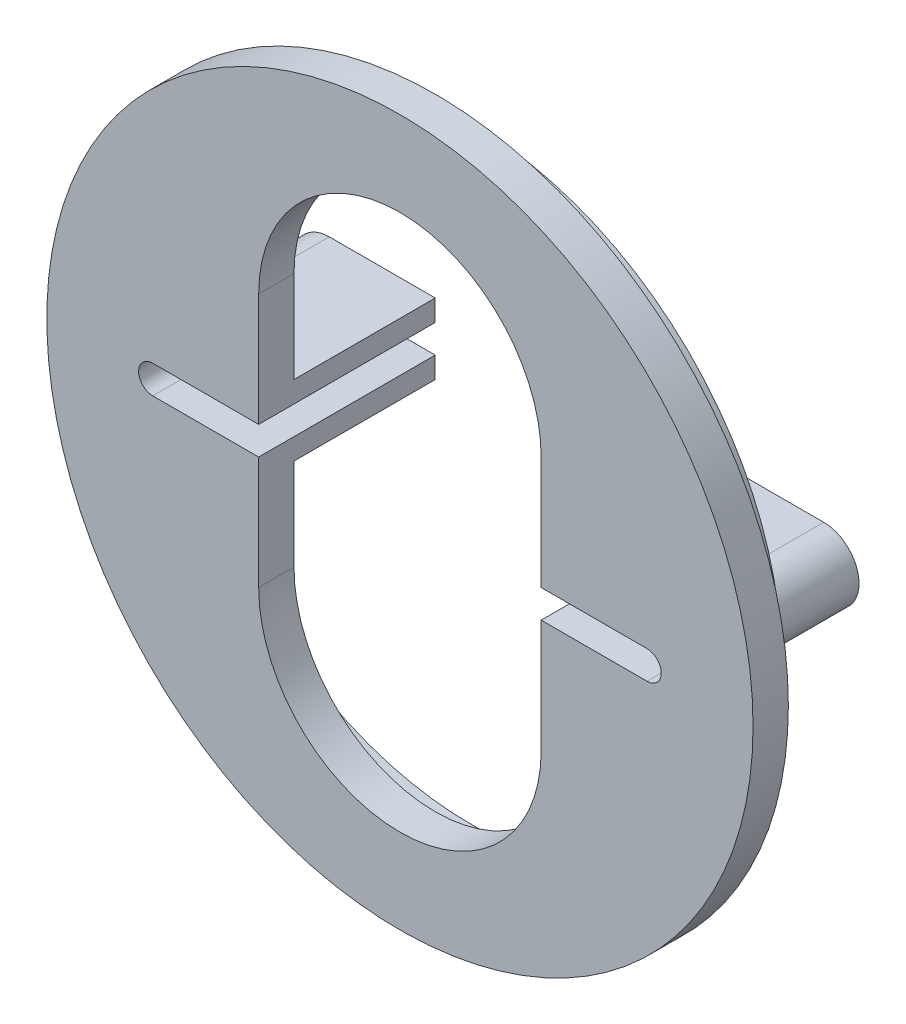
ISO-10303-21;
HEADER;
FILE_DESCRIPTION(('STEP AP214'),'2;1');
FILE_NAME('part.step','',(''),(''),'','','');
FILE_SCHEMA(('AUTOMOTIVE_DESIGN { 1 0 10303 214 1 1 1 1 }'));
ENDSEC;
DATA;
#1=APPLICATION_CONTEXT('core data for automotive mechanical design processes');
#2=APPLICATION_PROTOCOL_DEFINITION('international standard','automotive_design',2000,#1);
#3=PRODUCT_CONTEXT('',#1,'mechanical');
#4=PRODUCT('Part','Part','',(#3));
#5=PRODUCT_RELATED_PRODUCT_CATEGORY('part','',(#4));
#6=PRODUCT_DEFINITION_FORMATION('','',#4);
#7=PRODUCT_DEFINITION_CONTEXT('part definition',#1,'design');
#8=PRODUCT_DEFINITION('design','',#6,#7);
#9=PRODUCT_DEFINITION_SHAPE('','',#8);
#10=(LENGTH_UNIT() NAMED_UNIT(*) SI_UNIT(.MILLI.,.METRE.));
#11=(NAMED_UNIT(*) PLANE_ANGLE_UNIT() SI_UNIT($,.RADIAN.));
#12=(NAMED_UNIT(*) SI_UNIT($,.STERADIAN.) SOLID_ANGLE_UNIT());
#13=UNCERTAINTY_MEASURE_WITH_UNIT(LENGTH_MEASURE(1.E-05),#10,'distance_accuracy_value','');
#14=(GEOMETRIC_REPRESENTATION_CONTEXT(3) GLOBAL_UNCERTAINTY_ASSIGNED_CONTEXT((#13)) GLOBAL_UNIT_ASSIGNED_CONTEXT((#10,
#11,#12)) REPRESENTATION_CONTEXT('',''));
#15=CARTESIAN_POINT('',(0.,0.,0.));
#16=DIRECTION('',(0.,0.,1.));
#17=DIRECTION('',(1.,0.,0.));
#18=AXIS2_PLACEMENT_3D('',#15,#16,#17);
#19=CARTESIAN_POINT('',(0.,0.,0.));
#20=DIRECTION('',(0.,0.,1.));
#21=DIRECTION('',(1.,0.,0.));
#22=AXIS2_PLACEMENT_3D('',#19,#20,#21);
#23=PLANE('',#22);
#24=DIRECTION('',(0.,-1.,0.));
#25=VECTOR('',#24,1.);
#26=CARTESIAN_POINT('',(-20.,0.,0.));
#27=LINE('',#26,#25);
#28=CARTESIAN_POINT('',(-20.,18.,0.));
#29=VERTEX_POINT('',#28);
#30=CARTESIAN_POINT('',(-20.,5.,0.));
#31=VERTEX_POINT('',#30);
#32=EDGE_CURVE('E358',#29,#31,#27,.T.);
#33=ORIENTED_EDGE('',*,*,#32,.T.);
#34=DIRECTION('',(-1.,0.,0.));
#35=VECTOR('',#34,1.);
#36=CARTESIAN_POINT('',(0.,5.,0.));
#37=LINE('',#36,#35);
#38=CARTESIAN_POINT('',(-35.,5.,0.));
#39=VERTEX_POINT('',#38);
#40=EDGE_CURVE('E233',#31,#39,#37,.T.);
#41=ORIENTED_EDGE('',*,*,#40,.T.);
#42=CARTESIAN_POINT('',(-35.,0.,0.));
#43=DIRECTION('',(0.,0.,1.));
#44=DIRECTION('',(1.,0.,0.));
#45=AXIS2_PLACEMENT_3D('',#42,#43,#44);
#46=CIRCLE('',#45,5.);
#47=CARTESIAN_POINT('',(-35.,-5.,0.));
#48=VERTEX_POINT('',#47);
#49=EDGE_CURVE('E185',#39,#48,#46,.T.);
#50=ORIENTED_EDGE('',*,*,#49,.T.);
#51=DIRECTION('',(-1.,0.,0.));
#52=VECTOR('',#51,1.);
#53=CARTESIAN_POINT('',(0.,-5.,0.));
#54=LINE('',#53,#52);
#55=CARTESIAN_POINT('',(-20.,-5.,0.));
#56=VERTEX_POINT('',#55);
#57=EDGE_CURVE('E57',#56,#48,#54,.T.);
#58=ORIENTED_EDGE('',*,*,#57,.F.);
#59=DIRECTION('',(0.,-1.,0.));
#60=VECTOR('',#59,1.);
#61=CARTESIAN_POINT('',(-20.,0.,0.));
#62=LINE('',#61,#60);
#63=CARTESIAN_POINT('',(-20.,-18.,0.));
#64=VERTEX_POINT('',#63);
#65=EDGE_CURVE('E355',#56,#64,#62,.T.);
#66=ORIENTED_EDGE('',*,*,#65,.T.);
#67=CARTESIAN_POINT('',(0.,-18.,0.));
#68=DIRECTION('',(0.,0.,1.));
#69=DIRECTION('',(1.,0.,0.));
#70=AXIS2_PLACEMENT_3D('',#67,#68,#69);
#71=CIRCLE('',#70,20.);
#72=CARTESIAN_POINT('',(20.,-18.,0.));
#73=VERTEX_POINT('',#72);
#74=EDGE_CURVE('E350',#73,#64,#71,.F.);
#75=ORIENTED_EDGE('',*,*,#74,.F.);
#76=DIRECTION('',(0.,-1.,0.));
#77=VECTOR('',#76,1.);
#78=CARTESIAN_POINT('',(20.,0.,0.));
#79=LINE('',#78,#77);
#80=CARTESIAN_POINT('',(20.,-5.,0.));
#81=VERTEX_POINT('',#80);
#82=EDGE_CURVE('E291',#81,#73,#79,.T.);
#83=ORIENTED_EDGE('',*,*,#82,.F.);
#84=DIRECTION('',(1.,0.,0.));
#85=VECTOR('',#84,1.);
#86=CARTESIAN_POINT('',(0.,-5.,0.));
#87=LINE('',#86,#85);
#88=CARTESIAN_POINT('',(35.,-5.,0.));
#89=VERTEX_POINT('',#88);
#90=EDGE_CURVE('E65',#81,#89,#87,.T.);
#91=ORIENTED_EDGE('',*,*,#90,.T.);
#92=CARTESIAN_POINT('',(35.,0.,0.));
#93=DIRECTION('',(0.,0.,1.));
#94=DIRECTION('',(1.,0.,0.));
#95=AXIS2_PLACEMENT_3D('',#92,#93,#94);
#96=CIRCLE('',#95,5.);
#97=CARTESIAN_POINT('',(35.,5.,0.));
#98=VERTEX_POINT('',#97);
#99=EDGE_CURVE('E280',#98,#89,#96,.F.);
#100=ORIENTED_EDGE('',*,*,#99,.F.);
#101=DIRECTION('',(1.,0.,0.));
#102=VECTOR('',#101,1.);
#103=CARTESIAN_POINT('',(0.,5.,0.));
#104=LINE('',#103,#102);
#105=CARTESIAN_POINT('',(20.,5.,0.));
#106=VERTEX_POINT('',#105);
#107=EDGE_CURVE('E251',#106,#98,#104,.T.);
#108=ORIENTED_EDGE('',*,*,#107,.F.);
#109=CARTESIAN_POINT('',(20.,18.,0.));
#110=VERTEX_POINT('',#109);
#111=EDGE_CURVE('E351',#110,#106,#79,.T.);
#112=ORIENTED_EDGE('',*,*,#111,.F.);
#113=CARTESIAN_POINT('',(0.,18.,0.));
#114=DIRECTION('',(0.,0.,1.));
#115=DIRECTION('',(1.,0.,0.));
#116=AXIS2_PLACEMENT_3D('',#113,#114,#115);
#117=CIRCLE('',#116,20.);
#118=EDGE_CURVE('E362',#110,#29,#117,.T.);
#119=ORIENTED_EDGE('',*,*,#118,.T.);
#120=EDGE_LOOP('',(#33,#41,#50,#58,#66,#75,#83,#91,#100,#108,#112,#119));
#121=FACE_BOUND('',#120,.T.);
#122=CARTESIAN_POINT('',(0.,0.,0.));
#123=DIRECTION('',(0.,0.,1.));
#124=DIRECTION('',(1.,0.,0.));
#125=AXIS2_PLACEMENT_3D('',#122,#123,#124);
#126=CIRCLE('',#125,42.);
#127=CARTESIAN_POINT('',(42.,0.,0.));
#128=VERTEX_POINT('',#127);
#129=EDGE_CURVE('E11',#128,#128,#126,.T.);
#130=ORIENTED_EDGE('',*,*,#129,.F.);
#131=EDGE_LOOP('',(#130));
#132=FACE_BOUND('',#131,.T.);
#133=ADVANCED_FACE('F41',(#121,#132),#23,.F.);
#134=CARTESIAN_POINT('',(35.,0.,5.));
#135=DIRECTION('',(0.,0.,-1.));
#136=DIRECTION('',(-1.,0.,0.));
#137=AXIS2_PLACEMENT_3D('',#134,#135,#136);
#138=CYLINDRICAL_SURFACE('',#137,2.);
#139=DIRECTION('',(0.,0.,-1.));
#140=VECTOR('',#139,1.);
#141=CARTESIAN_POINT('',(35.,2.,5.));
#142=LINE('',#141,#140);
#143=CARTESIAN_POINT('',(35.,2.,5.));
#144=VERTEX_POINT('',#143);
#145=CARTESIAN_POINT('',(35.,2.,-20.));
#146=VERTEX_POINT('',#145);
#147=EDGE_CURVE('E347',#144,#146,#142,.T.);
#148=ORIENTED_EDGE('',*,*,#147,.T.);
#149=CARTESIAN_POINT('',(35.,0.,-20.));
#150=DIRECTION('',(0.,0.,1.));
#151=DIRECTION('',(1.,0.,0.));
#152=AXIS2_PLACEMENT_3D('',#149,#150,#151);
#153=CIRCLE('',#152,2.);
#154=CARTESIAN_POINT('',(35.,-2.,-20.));
#155=VERTEX_POINT('',#154);
#156=EDGE_CURVE('E250',#146,#155,#153,.F.);
#157=ORIENTED_EDGE('',*,*,#156,.T.);
#158=DIRECTION('',(0.,0.,-1.));
#159=VECTOR('',#158,1.);
#160=CARTESIAN_POINT('',(35.,-2.,5.));
#161=LINE('',#160,#159);
#162=CARTESIAN_POINT('',(35.,-2.,5.));
#163=VERTEX_POINT('',#162);
#164=EDGE_CURVE('E50',#163,#155,#161,.T.);
#165=ORIENTED_EDGE('',*,*,#164,.F.);
#166=CARTESIAN_POINT('',(35.,0.,5.));
#167=DIRECTION('',(0.,0.,1.));
#168=DIRECTION('',(1.,0.,0.));
#169=AXIS2_PLACEMENT_3D('',#166,#167,#168);
#170=CIRCLE('',#169,2.);
#171=EDGE_CURVE('E302',#144,#163,#170,.F.);
#172=ORIENTED_EDGE('',*,*,#171,.F.);
#173=EDGE_LOOP('',(#148,#157,#165,#172));
#174=FACE_BOUND('',#173,.T.);
#175=ADVANCED_FACE('F43',(#174),#138,.F.);
#176=CARTESIAN_POINT('',(0.,-2.,5.));
#177=DIRECTION('',(0.,1.,0.));
#178=DIRECTION('',(-1.,0.,0.));
#179=AXIS2_PLACEMENT_3D('',#176,#177,#178);
#180=PLANE('',#179);
#181=ORIENTED_EDGE('',*,*,#164,.T.);
#182=DIRECTION('',(1.,0.,0.));
#183=VECTOR('',#182,1.);
#184=CARTESIAN_POINT('',(0.,-2.,-20.));
#185=LINE('',#184,#183);
#186=CARTESIAN_POINT('',(20.,-2.,-20.));
#187=VERTEX_POINT('',#186);
#188=EDGE_CURVE('E255',#187,#155,#185,.T.);
#189=ORIENTED_EDGE('',*,*,#188,.F.);
#190=DIRECTION('',(0.,0.,-1.));
#191=VECTOR('',#190,1.);
#192=CARTESIAN_POINT('',(20.,-2.,5.));
#193=LINE('',#192,#191);
#194=CARTESIAN_POINT('',(20.,-2.,5.));
#195=VERTEX_POINT('',#194);
#196=EDGE_CURVE('E400',#195,#187,#193,.T.);
#197=ORIENTED_EDGE('',*,*,#196,.F.);
#198=DIRECTION('',(1.,0.,0.));
#199=VECTOR('',#198,1.);
#200=CARTESIAN_POINT('',(0.,-2.,5.));
#201=LINE('',#200,#199);
#202=EDGE_CURVE('E305',#195,#163,#201,.T.);
#203=ORIENTED_EDGE('',*,*,#202,.T.);
#204=EDGE_LOOP('',(#181,#189,#197,#203));
#205=FACE_BOUND('',#204,.T.);
#206=ADVANCED_FACE('F406',(#205),#180,.T.);
#207=CARTESIAN_POINT('',(20.,0.,5.));
#208=DIRECTION('',(1.,0.,0.));
#209=DIRECTION('',(0.,0.,-1.));
#210=AXIS2_PLACEMENT_3D('',#207,#208,#209);
#211=PLANE('',#210);
#212=ORIENTED_EDGE('',*,*,#196,.T.);
#213=DIRECTION('',(0.,-1.,0.));
#214=VECTOR('',#213,1.);
#215=CARTESIAN_POINT('',(20.,0.,-20.));
#216=LINE('',#215,#214);
#217=CARTESIAN_POINT('',(20.,-5.,-20.));
#218=VERTEX_POINT('',#217);
#219=EDGE_CURVE('E259',#187,#218,#216,.T.);
#220=ORIENTED_EDGE('',*,*,#219,.T.);
#221=DIRECTION('',(0.,0.,1.));
#222=VECTOR('',#221,1.);
#223=CARTESIAN_POINT('',(20.,-5.,-20.));
#224=LINE('',#223,#222);
#225=EDGE_CURVE('E277',#218,#81,#224,.T.);
#226=ORIENTED_EDGE('',*,*,#225,.T.);
#227=ORIENTED_EDGE('',*,*,#82,.T.);
#228=DIRECTION('',(0.,0.,-1.));
#229=VECTOR('',#228,1.);
#230=CARTESIAN_POINT('',(20.,-18.,5.));
#231=LINE('',#230,#229);
#232=CARTESIAN_POINT('',(20.,-18.,5.));
#233=VERTEX_POINT('',#232);
#234=EDGE_CURVE('E396',#233,#73,#231,.T.);
#235=ORIENTED_EDGE('',*,*,#234,.F.);
#236=DIRECTION('',(0.,-1.,0.));
#237=VECTOR('',#236,1.);
#238=CARTESIAN_POINT('',(20.,0.,5.));
#239=LINE('',#238,#237);
#240=EDGE_CURVE('E310',#195,#233,#239,.T.);
#241=ORIENTED_EDGE('',*,*,#240,.F.);
#242=EDGE_LOOP('',(#212,#220,#226,#227,#235,#241));
#243=FACE_BOUND('',#242,.T.);
#244=ADVANCED_FACE('F438',(#243),#211,.F.);
#245=CARTESIAN_POINT('',(0.,-18.,5.));
#246=DIRECTION('',(0.,0.,-1.));
#247=DIRECTION('',(-1.,0.,0.));
#248=AXIS2_PLACEMENT_3D('',#245,#246,#247);
#249=CYLINDRICAL_SURFACE('',#248,20.);
#250=ORIENTED_EDGE('',*,*,#74,.T.);
#251=DIRECTION('',(0.,0.,-1.));
#252=VECTOR('',#251,1.);
#253=CARTESIAN_POINT('',(-20.,-18.,5.));
#254=LINE('',#253,#252);
#255=CARTESIAN_POINT('',(-20.,-18.,5.));
#256=VERTEX_POINT('',#255);
#257=EDGE_CURVE('E392',#256,#64,#254,.T.);
#258=ORIENTED_EDGE('',*,*,#257,.F.);
#259=CARTESIAN_POINT('',(0.,-18.,5.));
#260=DIRECTION('',(0.,0.,1.));
#261=DIRECTION('',(1.,0.,0.));
#262=AXIS2_PLACEMENT_3D('',#259,#260,#261);
#263=CIRCLE('',#262,20.);
#264=EDGE_CURVE('E313',#233,#256,#263,.F.);
#265=ORIENTED_EDGE('',*,*,#264,.F.);
#266=ORIENTED_EDGE('',*,*,#234,.T.);
#267=EDGE_LOOP('',(#250,#258,#265,#266));
#268=FACE_BOUND('',#267,.T.);
#269=ADVANCED_FACE('F465',(#268),#249,.F.);
#270=CARTESIAN_POINT('',(-20.,0.,5.));
#271=DIRECTION('',(1.,0.,0.));
#272=DIRECTION('',(0.,0.,-1.));
#273=AXIS2_PLACEMENT_3D('',#270,#271,#272);
#274=PLANE('',#273);
#275=ORIENTED_EDGE('',*,*,#65,.F.);
#276=DIRECTION('',(0.,0.,1.));
#277=VECTOR('',#276,1.);
#278=CARTESIAN_POINT('',(-20.,-5.,-20.));
#279=LINE('',#278,#277);
#280=CARTESIAN_POINT('',(-20.,-5.,-20.));
#281=VERTEX_POINT('',#280);
#282=EDGE_CURVE('E241',#281,#56,#279,.T.);
#283=ORIENTED_EDGE('',*,*,#282,.F.);
#284=DIRECTION('',(0.,-1.,0.));
#285=VECTOR('',#284,1.);
#286=CARTESIAN_POINT('',(-20.,0.,-20.));
#287=LINE('',#286,#285);
#288=CARTESIAN_POINT('',(-20.,-2.,-20.));
#289=VERTEX_POINT('',#288);
#290=EDGE_CURVE('E216',#289,#281,#287,.T.);
#291=ORIENTED_EDGE('',*,*,#290,.F.);
#292=DIRECTION('',(0.,0.,-1.));
#293=VECTOR('',#292,1.);
#294=CARTESIAN_POINT('',(-20.,-2.,5.));
#295=LINE('',#294,#293);
#296=CARTESIAN_POINT('',(-20.,-2.,5.));
#297=VERTEX_POINT('',#296);
#298=EDGE_CURVE('E389',#297,#289,#295,.T.);
#299=ORIENTED_EDGE('',*,*,#298,.F.);
#300=DIRECTION('',(0.,-1.,0.));
#301=VECTOR('',#300,1.);
#302=CARTESIAN_POINT('',(-20.,0.,5.));
#303=LINE('',#302,#301);
#304=EDGE_CURVE('E317',#297,#256,#303,.T.);
#305=ORIENTED_EDGE('',*,*,#304,.T.);
#306=ORIENTED_EDGE('',*,*,#257,.T.);
#307=EDGE_LOOP('',(#275,#283,#291,#299,#305,#306));
#308=FACE_BOUND('',#307,.T.);
#309=ADVANCED_FACE('F460',(#308),#274,.T.);
#310=CARTESIAN_POINT('',(0.,-2.,5.));
#311=DIRECTION('',(0.,-1.,0.));
#312=DIRECTION('',(1.,0.,0.));
#313=AXIS2_PLACEMENT_3D('',#310,#311,#312);
#314=PLANE('',#313);
#315=ORIENTED_EDGE('',*,*,#298,.T.);
#316=DIRECTION('',(-1.,0.,0.));
#317=VECTOR('',#316,1.);
#318=CARTESIAN_POINT('',(0.,-2.,-20.));
#319=LINE('',#318,#317);
#320=CARTESIAN_POINT('',(-35.,-2.,-20.));
#321=VERTEX_POINT('',#320);
#322=EDGE_CURVE('E219',#289,#321,#319,.T.);
#323=ORIENTED_EDGE('',*,*,#322,.T.);
#324=DIRECTION('',(0.,0.,-1.));
#325=VECTOR('',#324,1.);
#326=CARTESIAN_POINT('',(-35.,-2.,5.));
#327=LINE('',#326,#325);
#328=CARTESIAN_POINT('',(-35.,-2.,5.));
#329=VERTEX_POINT('',#328);
#330=EDGE_CURVE('E386',#329,#321,#327,.T.);
#331=ORIENTED_EDGE('',*,*,#330,.F.);
#332=DIRECTION('',(-1.,0.,0.));
#333=VECTOR('',#332,1.);
#334=CARTESIAN_POINT('',(0.,-2.,5.));
#335=LINE('',#334,#333);
#336=EDGE_CURVE('E321',#297,#329,#335,.T.);
#337=ORIENTED_EDGE('',*,*,#336,.F.);
#338=EDGE_LOOP('',(#315,#323,#331,#337));
#339=FACE_BOUND('',#338,.T.);
#340=ADVANCED_FACE('F471',(#339),#314,.F.);
#341=CARTESIAN_POINT('',(-35.,0.,5.));
#342=DIRECTION('',(0.,0.,-1.));
#343=DIRECTION('',(-1.,0.,0.));
#344=AXIS2_PLACEMENT_3D('',#341,#342,#343);
#345=CYLINDRICAL_SURFACE('',#344,2.);
#346=ORIENTED_EDGE('',*,*,#330,.T.);
#347=CARTESIAN_POINT('',(-35.,0.,-20.));
#348=DIRECTION('',(0.,0.,1.));
#349=DIRECTION('',(1.,0.,0.));
#350=AXIS2_PLACEMENT_3D('',#347,#348,#349);
#351=CIRCLE('',#350,2.);
#352=CARTESIAN_POINT('',(-35.,2.,-20.));
#353=VERTEX_POINT('',#352);
#354=EDGE_CURVE('E223',#353,#321,#351,.T.);
#355=ORIENTED_EDGE('',*,*,#354,.F.);
#356=DIRECTION('',(0.,0.,-1.));
#357=VECTOR('',#356,1.);
#358=CARTESIAN_POINT('',(-35.,2.,5.));
#359=LINE('',#358,#357);
#360=CARTESIAN_POINT('',(-35.,2.,5.));
#361=VERTEX_POINT('',#360);
#362=EDGE_CURVE('E383',#361,#353,#359,.T.);
#363=ORIENTED_EDGE('',*,*,#362,.F.);
#364=CARTESIAN_POINT('',(-35.,0.,5.));
#365=DIRECTION('',(0.,0.,1.));
#366=DIRECTION('',(1.,0.,0.));
#367=AXIS2_PLACEMENT_3D('',#364,#365,#366);
#368=CIRCLE('',#367,2.);
#369=EDGE_CURVE('E324',#361,#329,#368,.T.);
#370=ORIENTED_EDGE('',*,*,#369,.T.);
#371=EDGE_LOOP('',(#346,#355,#363,#370));
#372=FACE_BOUND('',#371,.T.);
#373=ADVANCED_FACE('F475',(#372),#345,.F.);
#374=CARTESIAN_POINT('',(0.,2.,5.));
#375=DIRECTION('',(0.,-1.,0.));
#376=DIRECTION('',(1.,0.,0.));
#377=AXIS2_PLACEMENT_3D('',#374,#375,#376);
#378=PLANE('',#377);
#379=ORIENTED_EDGE('',*,*,#362,.T.);
#380=DIRECTION('',(-1.,0.,0.));
#381=VECTOR('',#380,1.);
#382=CARTESIAN_POINT('',(0.,2.,-20.));
#383=LINE('',#382,#381);
#384=CARTESIAN_POINT('',(-20.,2.,-20.));
#385=VERTEX_POINT('',#384);
#386=EDGE_CURVE('E227',#385,#353,#383,.T.);
#387=ORIENTED_EDGE('',*,*,#386,.F.);
#388=DIRECTION('',(0.,0.,-1.));
#389=VECTOR('',#388,1.);
#390=CARTESIAN_POINT('',(-20.,2.,5.));
#391=LINE('',#390,#389);
#392=CARTESIAN_POINT('',(-20.,2.,5.));
#393=VERTEX_POINT('',#392);
#394=EDGE_CURVE('E380',#393,#385,#391,.T.);
#395=ORIENTED_EDGE('',*,*,#394,.F.);
#396=DIRECTION('',(-1.,0.,0.));
#397=VECTOR('',#396,1.);
#398=CARTESIAN_POINT('',(0.,2.,5.));
#399=LINE('',#398,#397);
#400=EDGE_CURVE('E328',#393,#361,#399,.T.);
#401=ORIENTED_EDGE('',*,*,#400,.T.);
#402=EDGE_LOOP('',(#379,#387,#395,#401));
#403=FACE_BOUND('',#402,.T.);
#404=ADVANCED_FACE('F478',(#403),#378,.T.);
#405=CARTESIAN_POINT('',(-20.,0.,5.));
#406=DIRECTION('',(1.,0.,0.));
#407=DIRECTION('',(0.,0.,-1.));
#408=AXIS2_PLACEMENT_3D('',#405,#406,#407);
#409=PLANE('',#408);
#410=ORIENTED_EDGE('',*,*,#32,.F.);
#411=DIRECTION('',(0.,0.,-1.));
#412=VECTOR('',#411,1.);
#413=CARTESIAN_POINT('',(-20.,18.,5.));
#414=LINE('',#413,#412);
#415=CARTESIAN_POINT('',(-20.,18.,5.));
#416=VERTEX_POINT('',#415);
#417=EDGE_CURVE('E377',#416,#29,#414,.T.);
#418=ORIENTED_EDGE('',*,*,#417,.F.);
#419=DIRECTION('',(0.,-1.,0.));
#420=VECTOR('',#419,1.);
#421=CARTESIAN_POINT('',(-20.,0.,5.));
#422=LINE('',#421,#420);
#423=EDGE_CURVE('E332',#416,#393,#422,.T.);
#424=ORIENTED_EDGE('',*,*,#423,.T.);
#425=ORIENTED_EDGE('',*,*,#394,.T.);
#426=DIRECTION('',(0.,-1.,0.));
#427=VECTOR('',#426,1.);
#428=CARTESIAN_POINT('',(-20.,0.,-20.));
#429=LINE('',#428,#427);
#430=CARTESIAN_POINT('',(-20.,5.,-20.));
#431=VERTEX_POINT('',#430);
#432=EDGE_CURVE('E192',#431,#385,#429,.T.);
#433=ORIENTED_EDGE('',*,*,#432,.F.);
#434=DIRECTION('',(0.,0.,1.));
#435=VECTOR('',#434,1.);
#436=CARTESIAN_POINT('',(-20.,5.,-20.));
#437=LINE('',#436,#435);
#438=EDGE_CURVE('E204',#431,#31,#437,.T.);
#439=ORIENTED_EDGE('',*,*,#438,.T.);
#440=EDGE_LOOP('',(#410,#418,#424,#425,#433,#439));
#441=FACE_BOUND('',#440,.T.);
#442=ADVANCED_FACE('F455',(#441),#409,.T.);
#443=CARTESIAN_POINT('',(0.,18.,5.));
#444=DIRECTION('',(0.,0.,-1.));
#445=DIRECTION('',(-1.,0.,0.));
#446=AXIS2_PLACEMENT_3D('',#443,#444,#445);
#447=CYLINDRICAL_SURFACE('',#446,20.);
#448=ORIENTED_EDGE('',*,*,#118,.F.);
#449=DIRECTION('',(0.,0.,-1.));
#450=VECTOR('',#449,1.);
#451=CARTESIAN_POINT('',(20.,18.,5.));
#452=LINE('',#451,#450);
#453=CARTESIAN_POINT('',(20.,18.,5.));
#454=VERTEX_POINT('',#453);
#455=EDGE_CURVE('E374',#454,#110,#452,.T.);
#456=ORIENTED_EDGE('',*,*,#455,.F.);
#457=CARTESIAN_POINT('',(0.,18.,5.));
#458=DIRECTION('',(0.,0.,1.));
#459=DIRECTION('',(1.,0.,0.));
#460=AXIS2_PLACEMENT_3D('',#457,#458,#459);
#461=CIRCLE('',#460,20.);
#462=EDGE_CURVE('E336',#454,#416,#461,.T.);
#463=ORIENTED_EDGE('',*,*,#462,.T.);
#464=ORIENTED_EDGE('',*,*,#417,.T.);
#465=EDGE_LOOP('',(#448,#456,#463,#464));
#466=FACE_BOUND('',#465,.T.);
#467=ADVANCED_FACE('F452',(#466),#447,.F.);
#468=ORIENTED_EDGE('',*,*,#111,.T.);
#469=DIRECTION('',(0.,0.,1.));
#470=VECTOR('',#469,1.);
#471=CARTESIAN_POINT('',(20.,5.,-20.));
#472=LINE('',#471,#470);
#473=CARTESIAN_POINT('',(20.,5.,-20.));
#474=VERTEX_POINT('',#473);
#475=EDGE_CURVE('E287',#474,#106,#472,.T.);
#476=ORIENTED_EDGE('',*,*,#475,.F.);
#477=DIRECTION('',(0.,-1.,0.));
#478=VECTOR('',#477,1.);
#479=CARTESIAN_POINT('',(20.,0.,-20.));
#480=LINE('',#479,#478);
#481=CARTESIAN_POINT('',(20.,2.,-20.));
#482=VERTEX_POINT('',#481);
#483=EDGE_CURVE('E273',#474,#482,#480,.T.);
#484=ORIENTED_EDGE('',*,*,#483,.T.);
#485=DIRECTION('',(0.,0.,-1.));
#486=VECTOR('',#485,1.);
#487=CARTESIAN_POINT('',(20.,2.,5.));
#488=LINE('',#487,#486);
#489=CARTESIAN_POINT('',(20.,2.,5.));
#490=VERTEX_POINT('',#489);
#491=EDGE_CURVE('E371',#490,#482,#488,.T.);
#492=ORIENTED_EDGE('',*,*,#491,.F.);
#493=EDGE_CURVE('E314',#454,#490,#239,.T.);
#494=ORIENTED_EDGE('',*,*,#493,.F.);
#495=ORIENTED_EDGE('',*,*,#455,.T.);
#496=EDGE_LOOP('',(#468,#476,#484,#492,#494,#495));
#497=FACE_BOUND('',#496,.T.);
#498=ADVANCED_FACE('F424',(#497),#211,.F.);
#499=CARTESIAN_POINT('',(0.,2.,5.));
#500=DIRECTION('',(0.,1.,0.));
#501=DIRECTION('',(-1.,0.,0.));
#502=AXIS2_PLACEMENT_3D('',#499,#500,#501);
#503=PLANE('',#502);
#504=ORIENTED_EDGE('',*,*,#491,.T.);
#505=DIRECTION('',(1.,0.,0.));
#506=VECTOR('',#505,1.);
#507=CARTESIAN_POINT('',(0.,2.,-20.));
#508=LINE('',#507,#506);
#509=EDGE_CURVE('E246',#482,#146,#508,.T.);
#510=ORIENTED_EDGE('',*,*,#509,.T.);
#511=ORIENTED_EDGE('',*,*,#147,.F.);
#512=DIRECTION('',(1.,0.,0.));
#513=VECTOR('',#512,1.);
#514=CARTESIAN_POINT('',(0.,2.,5.));
#515=LINE('',#514,#513);
#516=EDGE_CURVE('E340',#490,#144,#515,.T.);
#517=ORIENTED_EDGE('',*,*,#516,.F.);
#518=EDGE_LOOP('',(#504,#510,#511,#517));
#519=FACE_BOUND('',#518,.T.);
#520=ADVANCED_FACE('F419',(#519),#503,.F.);
#521=CARTESIAN_POINT('',(0.,0.,5.));
#522=DIRECTION('',(0.,0.,-1.));
#523=DIRECTION('',(-1.,0.,0.));
#524=AXIS2_PLACEMENT_3D('',#521,#522,#523);
#525=CYLINDRICAL_SURFACE('',#524,50.);
#526=CARTESIAN_POINT('',(0.,0.,5.));
#527=DIRECTION('',(0.,0.,1.));
#528=DIRECTION('',(1.,0.,0.));
#529=AXIS2_PLACEMENT_3D('',#526,#527,#528);
#530=CIRCLE('',#529,50.);
#531=CARTESIAN_POINT('',(50.,0.,5.));
#532=VERTEX_POINT('',#531);
#533=EDGE_CURVE('E343',#532,#532,#530,.T.);
#534=ORIENTED_EDGE('',*,*,#533,.F.);
#535=EDGE_LOOP('',(#534));
#536=FACE_BOUND('',#535,.T.);
#537=CARTESIAN_POINT('',(0.,0.,0.));
#538=DIRECTION('',(0.,0.,1.));
#539=DIRECTION('',(1.,0.,0.));
#540=AXIS2_PLACEMENT_3D('',#537,#538,#539);
#541=CIRCLE('',#540,50.);
#542=CARTESIAN_POINT('',(50.,0.,0.));
#543=VERTEX_POINT('',#542);
#544=EDGE_CURVE('E306',#543,#543,#541,.T.);
#545=ORIENTED_EDGE('',*,*,#544,.T.);
#546=EDGE_LOOP('',(#545));
#547=FACE_BOUND('',#546,.T.);
#548=ADVANCED_FACE('F502',(#536,#547),#525,.T.);
#549=CARTESIAN_POINT('',(0.,0.,5.));
#550=DIRECTION('',(0.,0.,1.));
#551=DIRECTION('',(1.,0.,0.));
#552=AXIS2_PLACEMENT_3D('',#549,#550,#551);
#553=PLANE('',#552);
#554=ORIENTED_EDGE('',*,*,#171,.T.);
#555=ORIENTED_EDGE('',*,*,#202,.F.);
#556=ORIENTED_EDGE('',*,*,#240,.T.);
#557=ORIENTED_EDGE('',*,*,#264,.T.);
#558=ORIENTED_EDGE('',*,*,#304,.F.);
#559=ORIENTED_EDGE('',*,*,#336,.T.);
#560=ORIENTED_EDGE('',*,*,#369,.F.);
#561=ORIENTED_EDGE('',*,*,#400,.F.);
#562=ORIENTED_EDGE('',*,*,#423,.F.);
#563=ORIENTED_EDGE('',*,*,#462,.F.);
#564=ORIENTED_EDGE('',*,*,#493,.T.);
#565=ORIENTED_EDGE('',*,*,#516,.T.);
#566=EDGE_LOOP('',(#554,#555,#556,#557,#558,#559,#560,#561,#562,#563,#564,#565));
#567=FACE_BOUND('',#566,.T.);
#568=ORIENTED_EDGE('',*,*,#533,.T.);
#569=EDGE_LOOP('',(#568));
#570=FACE_BOUND('',#569,.T.);
#571=ADVANCED_FACE('F443',(#567,#570),#553,.T.);
#572=CARTESIAN_POINT('',(0.,0.,0.));
#573=DIRECTION('',(0.,0.,1.));
#574=DIRECTION('',(1.,0.,0.));
#575=AXIS2_PLACEMENT_3D('',#572,#573,#574);
#576=CIRCLE('',#575,44.);
#577=CARTESIAN_POINT('',(44.,0.,0.));
#578=VERTEX_POINT('',#577);
#579=EDGE_CURVE('E211',#578,#578,#576,.T.);
#580=ORIENTED_EDGE('',*,*,#579,.T.);
#581=EDGE_LOOP('',(#580));
#582=FACE_BOUND('',#581,.T.);
#583=ORIENTED_EDGE('',*,*,#544,.F.);
#584=EDGE_LOOP('',(#583));
#585=FACE_BOUND('',#584,.T.);
#586=ADVANCED_FACE('F489',(#582,#585),#23,.F.);
#587=CARTESIAN_POINT('',(0.,5.,-20.));
#588=DIRECTION('',(0.,-1.,0.));
#589=DIRECTION('',(1.,0.,0.));
#590=AXIS2_PLACEMENT_3D('',#587,#588,#589);
#591=PLANE('',#590);
#592=ORIENTED_EDGE('',*,*,#107,.T.);
#593=DIRECTION('',(0.,0.,1.));
#594=VECTOR('',#593,1.);
#595=CARTESIAN_POINT('',(35.,5.,-20.));
#596=LINE('',#595,#594);
#597=CARTESIAN_POINT('',(35.,5.,-20.));
#598=VERTEX_POINT('',#597);
#599=EDGE_CURVE('E292',#598,#98,#596,.T.);
#600=ORIENTED_EDGE('',*,*,#599,.F.);
#601=DIRECTION('',(1.,0.,0.));
#602=VECTOR('',#601,1.);
#603=CARTESIAN_POINT('',(0.,5.,-20.));
#604=LINE('',#603,#602);
#605=EDGE_CURVE('E270',#474,#598,#604,.T.);
#606=ORIENTED_EDGE('',*,*,#605,.F.);
#607=ORIENTED_EDGE('',*,*,#475,.T.);
#608=EDGE_LOOP('',(#592,#600,#606,#607));
#609=FACE_BOUND('',#608,.T.);
#610=ADVANCED_FACE('F430',(#609),#591,.F.);
#611=CARTESIAN_POINT('',(35.,0.,-20.));
#612=DIRECTION('',(0.,0.,1.));
#613=DIRECTION('',(1.,0.,0.));
#614=AXIS2_PLACEMENT_3D('',#611,#612,#613);
#615=CYLINDRICAL_SURFACE('',#614,5.);
#616=ORIENTED_EDGE('',*,*,#99,.T.);
#617=DIRECTION('',(0.,0.,1.));
#618=VECTOR('',#617,1.);
#619=CARTESIAN_POINT('',(35.,-5.,-20.));
#620=LINE('',#619,#618);
#621=CARTESIAN_POINT('',(35.,-5.,-20.));
#622=VERTEX_POINT('',#621);
#623=EDGE_CURVE('E296',#622,#89,#620,.T.);
#624=ORIENTED_EDGE('',*,*,#623,.F.);
#625=CARTESIAN_POINT('',(35.,0.,-20.));
#626=DIRECTION('',(0.,0.,1.));
#627=DIRECTION('',(1.,0.,0.));
#628=AXIS2_PLACEMENT_3D('',#625,#626,#627);
#629=CIRCLE('',#628,5.);
#630=EDGE_CURVE('E267',#598,#622,#629,.F.);
#631=ORIENTED_EDGE('',*,*,#630,.F.);
#632=ORIENTED_EDGE('',*,*,#599,.T.);
#633=EDGE_LOOP('',(#616,#624,#631,#632));
#634=FACE_BOUND('',#633,.T.);
#635=ADVANCED_FACE('F434',(#634),#615,.T.);
#636=CARTESIAN_POINT('',(0.,-5.,-20.));
#637=DIRECTION('',(0.,-1.,0.));
#638=DIRECTION('',(1.,0.,0.));
#639=AXIS2_PLACEMENT_3D('',#636,#637,#638);
#640=PLANE('',#639);
#641=ORIENTED_EDGE('',*,*,#90,.F.);
#642=ORIENTED_EDGE('',*,*,#225,.F.);
#643=DIRECTION('',(1.,0.,0.));
#644=VECTOR('',#643,1.);
#645=CARTESIAN_POINT('',(0.,-5.,-20.));
#646=LINE('',#645,#644);
#647=EDGE_CURVE('E263',#218,#622,#646,.T.);
#648=ORIENTED_EDGE('',*,*,#647,.T.);
#649=ORIENTED_EDGE('',*,*,#623,.T.);
#650=EDGE_LOOP('',(#641,#642,#648,#649));
#651=FACE_BOUND('',#650,.T.);
#652=ADVANCED_FACE('F436',(#651),#640,.T.);
#653=CARTESIAN_POINT('',(0.,0.,-20.));
#654=DIRECTION('',(0.,0.,1.));
#655=DIRECTION('',(1.,0.,0.));
#656=AXIS2_PLACEMENT_3D('',#653,#654,#655);
#657=PLANE('',#656);
#658=ORIENTED_EDGE('',*,*,#509,.F.);
#659=ORIENTED_EDGE('',*,*,#483,.F.);
#660=ORIENTED_EDGE('',*,*,#605,.T.);
#661=ORIENTED_EDGE('',*,*,#630,.T.);
#662=ORIENTED_EDGE('',*,*,#647,.F.);
#663=ORIENTED_EDGE('',*,*,#219,.F.);
#664=ORIENTED_EDGE('',*,*,#188,.T.);
#665=ORIENTED_EDGE('',*,*,#156,.F.);
#666=EDGE_LOOP('',(#658,#659,#660,#661,#662,#663,#664,#665));
#667=FACE_BOUND('',#666,.T.);
#668=ADVANCED_FACE('F414',(#667),#657,.F.);
#669=CARTESIAN_POINT('',(0.,5.,-20.));
#670=DIRECTION('',(0.,1.,0.));
#671=DIRECTION('',(-1.,0.,0.));
#672=AXIS2_PLACEMENT_3D('',#669,#670,#671);
#673=PLANE('',#672);
#674=ORIENTED_EDGE('',*,*,#40,.F.);
#675=ORIENTED_EDGE('',*,*,#438,.F.);
#676=DIRECTION('',(-1.,0.,0.));
#677=VECTOR('',#676,1.);
#678=CARTESIAN_POINT('',(0.,5.,-20.));
#679=LINE('',#678,#677);
#680=CARTESIAN_POINT('',(-35.,5.,-20.));
#681=VERTEX_POINT('',#680);
#682=EDGE_CURVE('E198',#431,#681,#679,.T.);
#683=ORIENTED_EDGE('',*,*,#682,.T.);
#684=DIRECTION('',(0.,0.,1.));
#685=VECTOR('',#684,1.);
#686=CARTESIAN_POINT('',(-35.,5.,-20.));
#687=LINE('',#686,#685);
#688=EDGE_CURVE('E180',#681,#39,#687,.T.);
#689=ORIENTED_EDGE('',*,*,#688,.T.);
#690=EDGE_LOOP('',(#674,#675,#683,#689));
#691=FACE_BOUND('',#690,.T.);
#692=ADVANCED_FACE('F203',(#691),#673,.T.);
#693=CARTESIAN_POINT('',(0.,-5.,-20.));
#694=DIRECTION('',(0.,1.,0.));
#695=DIRECTION('',(-1.,0.,0.));
#696=AXIS2_PLACEMENT_3D('',#693,#694,#695);
#697=PLANE('',#696);
#698=ORIENTED_EDGE('',*,*,#57,.T.);
#699=DIRECTION('',(0.,0.,1.));
#700=VECTOR('',#699,1.);
#701=CARTESIAN_POINT('',(-35.,-5.,-20.));
#702=LINE('',#701,#700);
#703=CARTESIAN_POINT('',(-35.,-5.,-20.));
#704=VERTEX_POINT('',#703);
#705=EDGE_CURVE('E191',#704,#48,#702,.T.);
#706=ORIENTED_EDGE('',*,*,#705,.F.);
#707=DIRECTION('',(-1.,0.,0.));
#708=VECTOR('',#707,1.);
#709=CARTESIAN_POINT('',(0.,-5.,-20.));
#710=LINE('',#709,#708);
#711=EDGE_CURVE('E200',#281,#704,#710,.T.);
#712=ORIENTED_EDGE('',*,*,#711,.F.);
#713=ORIENTED_EDGE('',*,*,#282,.T.);
#714=EDGE_LOOP('',(#698,#706,#712,#713));
#715=FACE_BOUND('',#714,.T.);
#716=ADVANCED_FACE('F573',(#715),#697,.F.);
#717=CARTESIAN_POINT('',(-35.,0.,-20.));
#718=DIRECTION('',(0.,0.,1.));
#719=DIRECTION('',(1.,0.,0.));
#720=AXIS2_PLACEMENT_3D('',#717,#718,#719);
#721=CYLINDRICAL_SURFACE('',#720,5.);
#722=ORIENTED_EDGE('',*,*,#49,.F.);
#723=ORIENTED_EDGE('',*,*,#688,.F.);
#724=CARTESIAN_POINT('',(-35.,0.,-20.));
#725=DIRECTION('',(0.,0.,1.));
#726=DIRECTION('',(1.,0.,0.));
#727=AXIS2_PLACEMENT_3D('',#724,#725,#726);
#728=CIRCLE('',#727,5.);
#729=EDGE_CURVE('E183',#681,#704,#728,.T.);
#730=ORIENTED_EDGE('',*,*,#729,.T.);
#731=ORIENTED_EDGE('',*,*,#705,.T.);
#732=EDGE_LOOP('',(#722,#723,#730,#731));
#733=FACE_BOUND('',#732,.T.);
#734=ADVANCED_FACE('F182',(#733),#721,.T.);
#735=CARTESIAN_POINT('',(0.,0.,-20.));
#736=DIRECTION('',(0.,0.,1.));
#737=DIRECTION('',(1.,0.,0.));
#738=AXIS2_PLACEMENT_3D('',#735,#736,#737);
#739=PLANE('',#738);
#740=ORIENTED_EDGE('',*,*,#682,.F.);
#741=ORIENTED_EDGE('',*,*,#432,.T.);
#742=ORIENTED_EDGE('',*,*,#386,.T.);
#743=ORIENTED_EDGE('',*,*,#354,.T.);
#744=ORIENTED_EDGE('',*,*,#322,.F.);
#745=ORIENTED_EDGE('',*,*,#290,.T.);
#746=ORIENTED_EDGE('',*,*,#711,.T.);
#747=ORIENTED_EDGE('',*,*,#729,.F.);
#748=EDGE_LOOP('',(#740,#741,#742,#743,#744,#745,#746,#747));
#749=FACE_BOUND('',#748,.T.);
#750=ADVANCED_FACE('F196',(#749),#739,.F.);
#751=CARTESIAN_POINT('',(0.,0.,-5.));
#752=DIRECTION('',(0.,0.,1.));
#753=DIRECTION('',(1.,0.,0.));
#754=AXIS2_PLACEMENT_3D('',#751,#752,#753);
#755=CYLINDRICAL_SURFACE('',#754,44.);
#756=CARTESIAN_POINT('',(0.,0.,-5.));
#757=DIRECTION('',(0.,0.,1.));
#758=DIRECTION('',(1.,0.,0.));
#759=AXIS2_PLACEMENT_3D('',#756,#757,#758);
#760=CIRCLE('',#759,44.);
#761=CARTESIAN_POINT('',(44.,0.,-5.));
#762=VERTEX_POINT('',#761);
#763=EDGE_CURVE('E646',#762,#762,#760,.T.);
#764=ORIENTED_EDGE('',*,*,#763,.T.);
#765=EDGE_LOOP('',(#764));
#766=FACE_BOUND('',#765,.T.);
#767=ORIENTED_EDGE('',*,*,#579,.F.);
#768=EDGE_LOOP('',(#767));
#769=FACE_BOUND('',#768,.T.);
#770=ADVANCED_FACE('F597',(#766,#769),#755,.T.);
#771=CARTESIAN_POINT('',(0.,0.,-5.));
#772=DIRECTION('',(0.,0.,1.));
#773=DIRECTION('',(1.,0.,0.));
#774=AXIS2_PLACEMENT_3D('',#771,#772,#773);
#775=CYLINDRICAL_SURFACE('',#774,42.);
#776=CARTESIAN_POINT('',(0.,0.,-5.));
#777=DIRECTION('',(0.,0.,1.));
#778=DIRECTION('',(1.,0.,0.));
#779=AXIS2_PLACEMENT_3D('',#776,#777,#778);
#780=CIRCLE('',#779,42.);
#781=CARTESIAN_POINT('',(42.,0.,-5.));
#782=VERTEX_POINT('',#781);
#783=EDGE_CURVE('E236',#782,#782,#780,.T.);
#784=ORIENTED_EDGE('',*,*,#783,.F.);
#785=EDGE_LOOP('',(#784));
#786=FACE_BOUND('',#785,.T.);
#787=ORIENTED_EDGE('',*,*,#129,.T.);
#788=EDGE_LOOP('',(#787));
#789=FACE_BOUND('',#788,.T.);
#790=ADVANCED_FACE('F619',(#786,#789),#775,.F.);
#791=CARTESIAN_POINT('',(0.,0.,-5.));
#792=DIRECTION('',(0.,0.,1.));
#793=DIRECTION('',(1.,0.,0.));
#794=AXIS2_PLACEMENT_3D('',#791,#792,#793);
#795=PLANE('',#794);
#796=ORIENTED_EDGE('',*,*,#763,.F.);
#797=EDGE_LOOP('',(#796));
#798=FACE_BOUND('',#797,.T.);
#799=ORIENTED_EDGE('',*,*,#783,.T.);
#800=EDGE_LOOP('',(#799));
#801=FACE_BOUND('',#800,.T.);
#802=ADVANCED_FACE('F629',(#798,#801),#795,.F.);
#803=CLOSED_SHELL('',(#133,#175,#206,#244,#269,#309,#340,#373,#404,#442,#467,#498,#520,#548,
#571,#586,#610,#635,#652,#668,#692,#716,#734,#750,#770,#790,#802));
#804=MANIFOLD_SOLID_BREP('B2',#803);
#805=ADVANCED_BREP_SHAPE_REPRESENTATION('',(#18,#804),#14);
#806=SHAPE_DEFINITION_REPRESENTATION(#9,#805);
ENDSEC;
END-ISO-10303-21;
